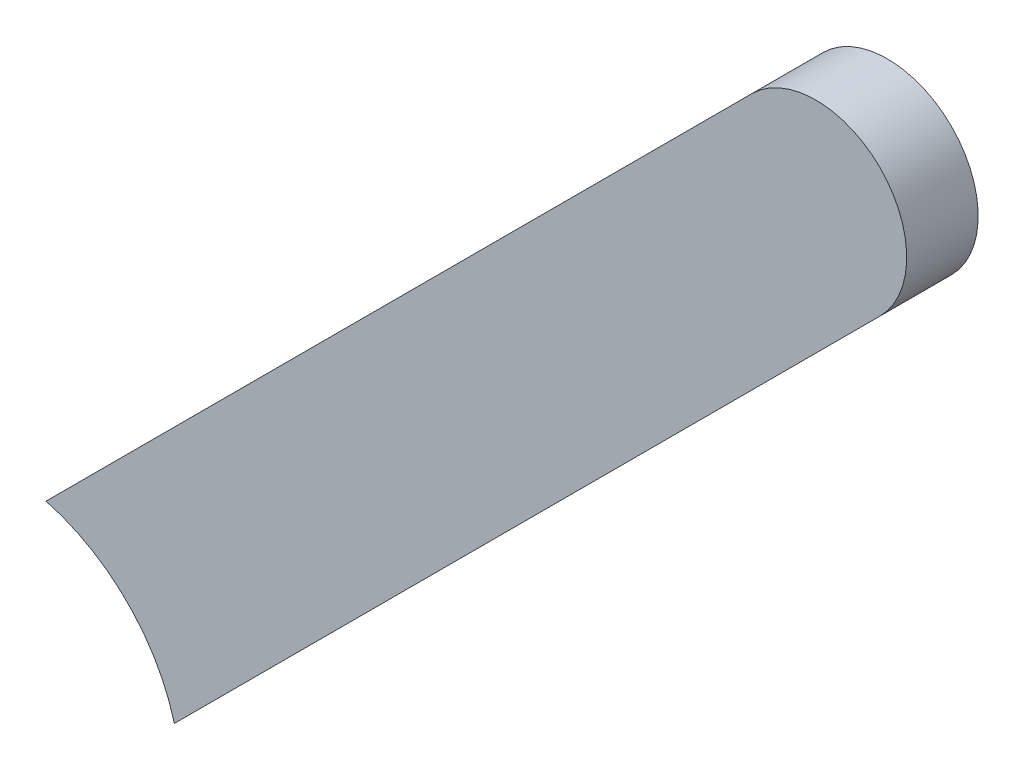
ISO-10303-21;
HEADER;
FILE_DESCRIPTION(('STEP AP214'),'2;1');
FILE_NAME('part.step','',(''),(''),'','','');
FILE_SCHEMA(('AUTOMOTIVE_DESIGN { 1 0 10303 214 1 1 1 1 }'));
ENDSEC;
DATA;
#1=APPLICATION_CONTEXT('core data for automotive mechanical design processes');
#2=APPLICATION_PROTOCOL_DEFINITION('international standard','automotive_design',2000,#1);
#3=PRODUCT_CONTEXT('',#1,'mechanical');
#4=PRODUCT('Part','Part','',(#3));
#5=PRODUCT_RELATED_PRODUCT_CATEGORY('part','',(#4));
#6=PRODUCT_DEFINITION_FORMATION('','',#4);
#7=PRODUCT_DEFINITION_CONTEXT('part definition',#1,'design');
#8=PRODUCT_DEFINITION('design','',#6,#7);
#9=PRODUCT_DEFINITION_SHAPE('','',#8);
#10=(LENGTH_UNIT() NAMED_UNIT(*) SI_UNIT(.MILLI.,.METRE.));
#11=(NAMED_UNIT(*) PLANE_ANGLE_UNIT() SI_UNIT($,.RADIAN.));
#12=(NAMED_UNIT(*) SI_UNIT($,.STERADIAN.) SOLID_ANGLE_UNIT());
#13=UNCERTAINTY_MEASURE_WITH_UNIT(LENGTH_MEASURE(1.E-05),#10,'distance_accuracy_value','');
#14=(GEOMETRIC_REPRESENTATION_CONTEXT(3) GLOBAL_UNCERTAINTY_ASSIGNED_CONTEXT((#13)) GLOBAL_UNIT_ASSIGNED_CONTEXT((#10,
#11,#12)) REPRESENTATION_CONTEXT('',''));
#15=CARTESIAN_POINT('',(0.,0.,0.));
#16=DIRECTION('',(0.,0.,1.));
#17=DIRECTION('',(1.,0.,0.));
#18=AXIS2_PLACEMENT_3D('',#15,#16,#17);
#19=CARTESIAN_POINT('',(90.6606906653028,113.034478785303,0.));
#20=DIRECTION('',(-0.707106781186548,0.707106781186548,0.));
#21=DIRECTION('',(0.707106781186548,0.707106781186548,0.));
#22=AXIS2_PLACEMENT_3D('',#19,#20,#21);
#23=PLANE('',#22);
#24=DIRECTION('',(0.707106781186548,0.707106781186548,0.));
#25=VECTOR('',#24,1.);
#26=CARTESIAN_POINT('',(90.34960594,112.72339406,0.1999996));
#27=LINE('',#26,#25);
#28=CARTESIAN_POINT('',(90.6606906653028,113.034478785303,0.1999996));
#29=VERTEX_POINT('',#28);
#30=CARTESIAN_POINT('',(92.63560594,115.00939406,0.1999996));
#31=VERTEX_POINT('',#30);
#32=EDGE_CURVE('E11',#29,#31,#27,.T.);
#33=ORIENTED_EDGE('',*,*,#32,.F.);
#34=DIRECTION('',(0.,0.,1.));
#35=VECTOR('',#34,1.);
#36=CARTESIAN_POINT('',(90.6606906653028,113.034478785303,0.));
#37=LINE('',#36,#35);
#38=CARTESIAN_POINT('',(90.6606906653028,113.034478785303,0.));
#39=VERTEX_POINT('',#38);
#40=EDGE_CURVE('E24',#39,#29,#37,.T.);
#41=ORIENTED_EDGE('',*,*,#40,.F.);
#42=DIRECTION('',(0.707106781186548,0.707106781186548,0.));
#43=VECTOR('',#42,1.);
#44=CARTESIAN_POINT('',(90.34960594,112.72339406,0.));
#45=LINE('',#44,#43);
#46=CARTESIAN_POINT('',(92.63560594,115.00939406,0.));
#47=VERTEX_POINT('',#46);
#48=EDGE_CURVE('E75',#39,#47,#45,.T.);
#49=ORIENTED_EDGE('',*,*,#48,.T.);
#50=DIRECTION('',(0.,0.,1.));
#51=VECTOR('',#50,1.);
#52=CARTESIAN_POINT('',(92.63560594,115.00939406,0.));
#53=LINE('',#52,#51);
#54=EDGE_CURVE('E37',#47,#31,#53,.T.);
#55=ORIENTED_EDGE('',*,*,#54,.T.);
#56=EDGE_LOOP('',(#33,#41,#49,#55));
#57=FACE_BOUND('',#56,.T.);
#58=ADVANCED_FACE('F17',(#57),#23,.F.);
#59=CARTESIAN_POINT('',(92.456,115.189,0.));
#60=DIRECTION('',(0.,0.,-1.));
#61=DIRECTION('',(0.707106781186548,-0.707106781186548,0.));
#62=AXIS2_PLACEMENT_3D('',#59,#60,#61);
#63=CYLINDRICAL_SURFACE('',#62,0.254001156230768);
#64=CARTESIAN_POINT('',(92.456,115.189,0.1999996));
#65=DIRECTION('',(0.,0.,1.));
#66=DIRECTION('',(0.707106781186548,-0.707106781186548,0.));
#67=AXIS2_PLACEMENT_3D('',#64,#65,#66);
#68=CIRCLE('',#67,0.254001156230768);
#69=CARTESIAN_POINT('',(92.27639406,115.36860594,0.1999996));
#70=VERTEX_POINT('',#69);
#71=EDGE_CURVE('E83',#31,#70,#68,.T.);
#72=ORIENTED_EDGE('',*,*,#71,.F.);
#73=ORIENTED_EDGE('',*,*,#54,.F.);
#74=CARTESIAN_POINT('',(92.456,115.189,0.));
#75=DIRECTION('',(0.,0.,1.));
#76=DIRECTION('',(0.707106781186548,-0.707106781186548,0.));
#77=AXIS2_PLACEMENT_3D('',#74,#75,#76);
#78=CIRCLE('',#77,0.254001156230768);
#79=CARTESIAN_POINT('',(92.27639406,115.36860594,0.));
#80=VERTEX_POINT('',#79);
#81=EDGE_CURVE('E81',#47,#80,#78,.T.);
#82=ORIENTED_EDGE('',*,*,#81,.T.);
#83=DIRECTION('',(0.,0.,1.));
#84=VECTOR('',#83,1.);
#85=CARTESIAN_POINT('',(92.27639406,115.36860594,0.));
#86=LINE('',#85,#84);
#87=EDGE_CURVE('E67',#80,#70,#86,.T.);
#88=ORIENTED_EDGE('',*,*,#87,.T.);
#89=EDGE_LOOP('',(#72,#73,#82,#88));
#90=FACE_BOUND('',#89,.T.);
#91=ADVANCED_FACE('F89',(#90),#63,.T.);
#92=CARTESIAN_POINT('',(92.27639406,115.36860594,0.));
#93=DIRECTION('',(0.707106781186548,-0.707106781186548,0.));
#94=DIRECTION('',(-0.707106781186548,-0.707106781186548,0.));
#95=AXIS2_PLACEMENT_3D('',#92,#93,#94);
#96=PLANE('',#95);
#97=DIRECTION('',(-0.707106781186548,-0.707106781186548,0.));
#98=VECTOR('',#97,1.);
#99=CARTESIAN_POINT('',(92.27639406,115.36860594,0.1999996));
#100=LINE('',#99,#98);
#101=CARTESIAN_POINT('',(90.3014787853028,113.393690665303,0.1999996));
#102=VERTEX_POINT('',#101);
#103=EDGE_CURVE('E71',#70,#102,#100,.T.);
#104=ORIENTED_EDGE('',*,*,#103,.F.);
#105=ORIENTED_EDGE('',*,*,#87,.F.);
#106=DIRECTION('',(-0.707106781186548,-0.707106781186548,0.));
#107=VECTOR('',#106,1.);
#108=CARTESIAN_POINT('',(92.27639406,115.36860594,0.));
#109=LINE('',#108,#107);
#110=CARTESIAN_POINT('',(90.3014787853028,113.393690665303,0.));
#111=VERTEX_POINT('',#110);
#112=EDGE_CURVE('E63',#80,#111,#109,.T.);
#113=ORIENTED_EDGE('',*,*,#112,.T.);
#114=DIRECTION('',(0.,0.,1.));
#115=VECTOR('',#114,1.);
#116=CARTESIAN_POINT('',(90.3014787853028,113.393690665303,0.));
#117=LINE('',#116,#115);
#118=EDGE_CURVE('E53',#111,#102,#117,.T.);
#119=ORIENTED_EDGE('',*,*,#118,.T.);
#120=EDGE_LOOP('',(#104,#105,#113,#119));
#121=FACE_BOUND('',#120,.T.);
#122=ADVANCED_FACE('F66',(#121),#96,.F.);
#123=CARTESIAN_POINT('',(90.17,112.903,0.));
#124=DIRECTION('',(0.,0.,-1.));
#125=DIRECTION('',(1.,0.,0.));
#126=AXIS2_PLACEMENT_3D('',#123,#124,#125);
#127=CYLINDRICAL_SURFACE('',#126,0.508);
#128=ORIENTED_EDGE('',*,*,#40,.T.);
#129=CARTESIAN_POINT('',(90.17,112.903,0.1999996));
#130=DIRECTION('',(0.,0.,1.));
#131=DIRECTION('',(1.,0.,0.));
#132=AXIS2_PLACEMENT_3D('',#129,#130,#131);
#133=CIRCLE('',#132,0.508);
#134=EDGE_CURVE('E59',#29,#102,#133,.T.);
#135=ORIENTED_EDGE('',*,*,#134,.T.);
#136=ORIENTED_EDGE('',*,*,#118,.F.);
#137=CARTESIAN_POINT('',(90.17,112.903,0.));
#138=DIRECTION('',(0.,0.,1.));
#139=DIRECTION('',(1.,0.,0.));
#140=AXIS2_PLACEMENT_3D('',#137,#138,#139);
#141=CIRCLE('',#140,0.508);
#142=EDGE_CURVE('E57',#39,#111,#141,.T.);
#143=ORIENTED_EDGE('',*,*,#142,.F.);
#144=EDGE_LOOP('',(#128,#135,#136,#143));
#145=FACE_BOUND('',#144,.T.);
#146=ADVANCED_FACE('F55',(#145),#127,.F.);
#147=CARTESIAN_POINT('',(90.34960594,112.72339406,0.));
#148=DIRECTION('',(0.,0.,-1.));
#149=DIRECTION('',(-1.,0.,0.));
#150=AXIS2_PLACEMENT_3D('',#147,#148,#149);
#151=PLANE('',#150);
#152=ORIENTED_EDGE('',*,*,#48,.F.);
#153=ORIENTED_EDGE('',*,*,#142,.T.);
#154=ORIENTED_EDGE('',*,*,#112,.F.);
#155=ORIENTED_EDGE('',*,*,#81,.F.);
#156=EDGE_LOOP('',(#152,#153,#154,#155));
#157=FACE_BOUND('',#156,.T.);
#158=ADVANCED_FACE('F74',(#157),#151,.T.);
#159=CARTESIAN_POINT('',(90.34960594,112.72339406,0.1999996));
#160=DIRECTION('',(0.,0.,-1.));
#161=DIRECTION('',(-1.,0.,0.));
#162=AXIS2_PLACEMENT_3D('',#159,#160,#161);
#163=PLANE('',#162);
#164=ORIENTED_EDGE('',*,*,#134,.F.);
#165=ORIENTED_EDGE('',*,*,#32,.T.);
#166=ORIENTED_EDGE('',*,*,#71,.T.);
#167=ORIENTED_EDGE('',*,*,#103,.T.);
#168=EDGE_LOOP('',(#164,#165,#166,#167));
#169=FACE_BOUND('',#168,.T.);
#170=ADVANCED_FACE('F91',(#169),#163,.F.);
#171=CLOSED_SHELL('',(#58,#91,#122,#146,#158,#170));
#172=MANIFOLD_SOLID_BREP('B1',#171);
#173=ADVANCED_BREP_SHAPE_REPRESENTATION('',(#18,#172),#14);
#174=SHAPE_DEFINITION_REPRESENTATION(#9,#173);
ENDSEC;
END-ISO-10303-21;
